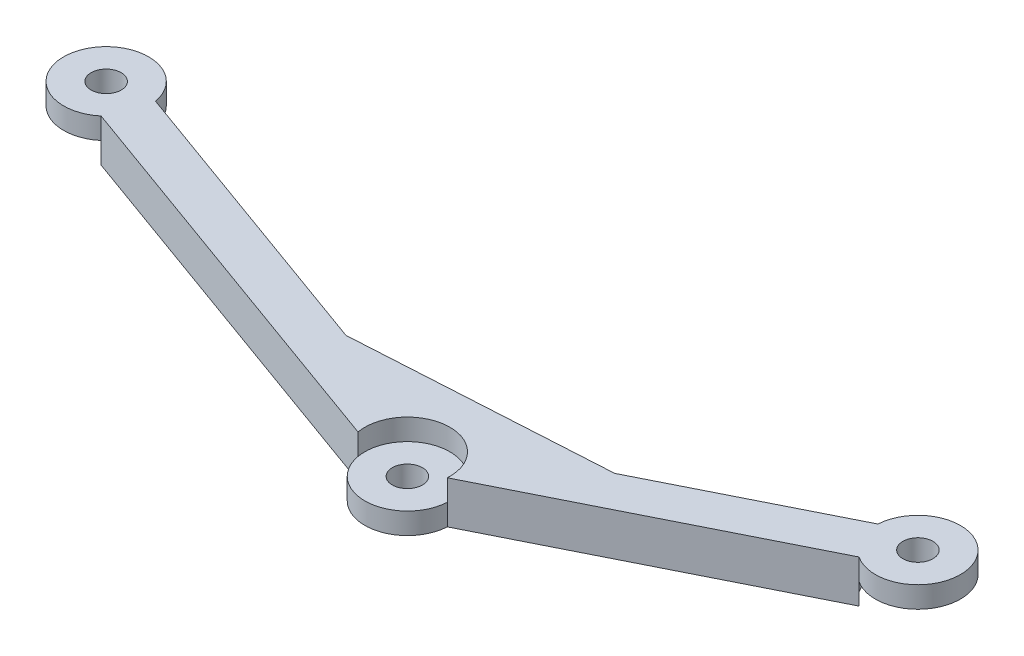
ISO-10303-21;
HEADER;
FILE_DESCRIPTION(('STEP AP214'),'2;1');
FILE_NAME('part.step','',(''),(''),'','','');
FILE_SCHEMA(('AUTOMOTIVE_DESIGN { 1 0 10303 214 1 1 1 1 }'));
ENDSEC;
DATA;
#1=APPLICATION_CONTEXT('core data for automotive mechanical design processes');
#2=APPLICATION_PROTOCOL_DEFINITION('international standard','automotive_design',2000,#1);
#3=PRODUCT_CONTEXT('',#1,'mechanical');
#4=PRODUCT('Part','Part','',(#3));
#5=PRODUCT_RELATED_PRODUCT_CATEGORY('part','',(#4));
#6=PRODUCT_DEFINITION_FORMATION('','',#4);
#7=PRODUCT_DEFINITION_CONTEXT('part definition',#1,'design');
#8=PRODUCT_DEFINITION('design','',#6,#7);
#9=PRODUCT_DEFINITION_SHAPE('','',#8);
#10=(LENGTH_UNIT() NAMED_UNIT(*) SI_UNIT(.MILLI.,.METRE.));
#11=(NAMED_UNIT(*) PLANE_ANGLE_UNIT() SI_UNIT($,.RADIAN.));
#12=(NAMED_UNIT(*) SI_UNIT($,.STERADIAN.) SOLID_ANGLE_UNIT());
#13=UNCERTAINTY_MEASURE_WITH_UNIT(LENGTH_MEASURE(1.E-05),#10,'distance_accuracy_value','');
#14=(GEOMETRIC_REPRESENTATION_CONTEXT(3) GLOBAL_UNCERTAINTY_ASSIGNED_CONTEXT((#13)) GLOBAL_UNIT_ASSIGNED_CONTEXT((#10,
#11,#12)) REPRESENTATION_CONTEXT('',''));
#15=CARTESIAN_POINT('',(0.,0.,0.));
#16=DIRECTION('',(0.,0.,1.));
#17=DIRECTION('',(1.,0.,0.));
#18=AXIS2_PLACEMENT_3D('',#15,#16,#17);
#19=CARTESIAN_POINT('',(22.8116968342877,6.35,45.6233936685753));
#20=DIRECTION('',(0.447213595499958,0.,0.894427190999916));
#21=DIRECTION('',(0.894427190999916,0.,-0.447213595499958));
#22=AXIS2_PLACEMENT_3D('',#19,#20,#21);
#23=PLANE('',#22);
#24=DIRECTION('',(0.,-1.,0.));
#25=VECTOR('',#24,1.);
#26=CARTESIAN_POINT('',(88.6237786073797,6.35,12.7173527820293));
#27=LINE('',#26,#25);
#28=CARTESIAN_POINT('',(88.6237786073797,6.35,12.7173527820293));
#29=VERTEX_POINT('',#28);
#30=CARTESIAN_POINT('',(88.6237786073797,0.,12.7173527820293));
#31=VERTEX_POINT('',#30);
#32=EDGE_CURVE('E129',#29,#31,#27,.T.);
#33=ORIENTED_EDGE('',*,*,#32,.F.);
#34=DIRECTION('',(-0.894427190999916,0.,0.447213595499958));
#35=VECTOR('',#34,1.);
#36=CARTESIAN_POINT('',(22.8116968342877,6.35,45.6233936685753));
#37=LINE('',#36,#35);
#38=CARTESIAN_POINT('',(114.819407984604,6.35,-0.380461906582968));
#39=VERTEX_POINT('',#38);
#40=EDGE_CURVE('E83',#39,#29,#37,.T.);
#41=ORIENTED_EDGE('',*,*,#40,.F.);
#42=DIRECTION('',(0.,-1.,0.));
#43=VECTOR('',#42,1.);
#44=CARTESIAN_POINT('',(114.819407984604,6.35,-0.380461906582968));
#45=LINE('',#44,#43);
#46=CARTESIAN_POINT('',(114.819407984604,3.175,-0.380461906582967));
#47=VERTEX_POINT('',#46);
#48=EDGE_CURVE('E42',#39,#47,#45,.T.);
#49=ORIENTED_EDGE('',*,*,#48,.T.);
#50=DIRECTION('',(0.,-1.,0.));
#51=VECTOR('',#50,1.);
#52=CARTESIAN_POINT('',(114.819407984604,3.175,-0.380461906582974));
#53=LINE('',#52,#51);
#54=CARTESIAN_POINT('',(114.819407984604,0.,-0.380461906582969));
#55=VERTEX_POINT('',#54);
#56=EDGE_CURVE('E215',#47,#55,#53,.T.);
#57=ORIENTED_EDGE('',*,*,#56,.T.);
#58=DIRECTION('',(-0.894427190999916,0.,0.447213595499958));
#59=VECTOR('',#58,1.);
#60=CARTESIAN_POINT('',(22.8116968342877,0.,45.6233936685753));
#61=LINE('',#60,#59);
#62=EDGE_CURVE('E140',#55,#31,#61,.T.);
#63=ORIENTED_EDGE('',*,*,#62,.T.);
#64=EDGE_LOOP('',(#33,#41,#49,#57,#63));
#65=FACE_BOUND('',#64,.T.);
#66=ADVANCED_FACE('F33',(#65),#23,.F.);
#67=CARTESIAN_POINT('',(1.07810624111919,6.35,-2.98635428790017));
#68=DIRECTION('',(-0.339561020824945,0.,0.940584027685098));
#69=DIRECTION('',(0.940584027685098,0.,0.339561020824945));
#70=AXIS2_PLACEMENT_3D('',#67,#68,#69);
#71=PLANE('',#70);
#72=DIRECTION('',(0.,-1.,0.));
#73=VECTOR('',#72,1.);
#74=CARTESIAN_POINT('',(50.7345465879939,6.35,14.9401584727044));
#75=LINE('',#74,#73);
#76=CARTESIAN_POINT('',(50.7345465879939,6.35,14.9401584727044));
#77=VERTEX_POINT('',#76);
#78=CARTESIAN_POINT('',(50.7345465879939,0.,14.9401584727044));
#79=VERTEX_POINT('',#78);
#80=EDGE_CURVE('E132',#77,#79,#75,.T.);
#81=ORIENTED_EDGE('',*,*,#80,.T.);
#82=DIRECTION('',(-0.940584027685098,0.,-0.339561020824945));
#83=VECTOR('',#82,1.);
#84=CARTESIAN_POINT('',(1.07810624111919,0.,-2.98635428790017));
#85=LINE('',#84,#83);
#86=CARTESIAN_POINT('',(6.2506235971635,0.,-1.11901950232461));
#87=VERTEX_POINT('',#86);
#88=EDGE_CURVE('E165',#79,#87,#85,.T.);
#89=ORIENTED_EDGE('',*,*,#88,.T.);
#90=DIRECTION('',(0.,-1.,0.));
#91=VECTOR('',#90,1.);
#92=CARTESIAN_POINT('',(6.2506235971635,3.175,-1.11901950232461));
#93=LINE('',#92,#91);
#94=CARTESIAN_POINT('',(6.2506235971635,3.175,-1.11901950232461));
#95=VERTEX_POINT('',#94);
#96=EDGE_CURVE('E195',#87,#95,#93,.F.);
#97=ORIENTED_EDGE('',*,*,#96,.T.);
#98=DIRECTION('',(0.,-1.,0.));
#99=VECTOR('',#98,1.);
#100=CARTESIAN_POINT('',(6.2506235971635,6.35,-1.11901950232461));
#101=LINE('',#100,#99);
#102=CARTESIAN_POINT('',(6.2506235971635,6.35,-1.11901950232461));
#103=VERTEX_POINT('',#102);
#104=EDGE_CURVE('E189',#103,#95,#101,.T.);
#105=ORIENTED_EDGE('',*,*,#104,.F.);
#106=DIRECTION('',(-0.940584027685098,0.,-0.339561020824945));
#107=VECTOR('',#106,1.);
#108=CARTESIAN_POINT('',(1.07810624111919,6.35,-2.98635428790017));
#109=LINE('',#108,#107);
#110=EDGE_CURVE('E147',#77,#103,#109,.T.);
#111=ORIENTED_EDGE('',*,*,#110,.F.);
#112=EDGE_LOOP('',(#81,#89,#97,#105,#111));
#113=FACE_BOUND('',#112,.T.);
#114=ADVANCED_FACE('F258',(#113),#71,.F.);
#115=CARTESIAN_POINT('',(70.358,6.35,25.4));
#116=DIRECTION('',(0.,-1.,0.));
#117=DIRECTION('',(0.,0.,-1.));
#118=AXIS2_PLACEMENT_3D('',#115,#116,#117);
#119=CYLINDRICAL_SURFACE('',#118,6.35);
#120=CARTESIAN_POINT('',(70.358,3.175,25.4));
#121=DIRECTION('',(0.,1.,0.));
#122=DIRECTION('',(0.,0.,1.));
#123=AXIS2_PLACEMENT_3D('',#120,#121,#122);
#124=CIRCLE('',#123,6.35000000000001);
#125=CARTESIAN_POINT('',(64.1073764028365,3.175,26.5190195023246));
#126=VERTEX_POINT('',#125);
#127=CARTESIAN_POINT('',(76.6965920153958,3.175,25.780461906583));
#128=VERTEX_POINT('',#127);
#129=EDGE_CURVE('E225',#126,#128,#124,.T.);
#130=ORIENTED_EDGE('',*,*,#129,.F.);
#131=DIRECTION('',(0.,-1.,0.));
#132=VECTOR('',#131,1.);
#133=CARTESIAN_POINT('',(64.1073764028365,6.35,26.5190195023246));
#134=LINE('',#133,#132);
#135=CARTESIAN_POINT('',(64.1073764028365,0.,26.5190195023246));
#136=VERTEX_POINT('',#135);
#137=EDGE_CURVE('E182',#126,#136,#134,.T.);
#138=ORIENTED_EDGE('',*,*,#137,.T.);
#139=CARTESIAN_POINT('',(70.358,0.,25.4));
#140=DIRECTION('',(0.,1.,0.));
#141=DIRECTION('',(0.,0.,1.));
#142=AXIS2_PLACEMENT_3D('',#139,#140,#141);
#143=CIRCLE('',#142,6.35);
#144=CARTESIAN_POINT('',(76.6965920153958,0.,25.780461906583));
#145=VERTEX_POINT('',#144);
#146=EDGE_CURVE('E171',#136,#145,#143,.T.);
#147=ORIENTED_EDGE('',*,*,#146,.T.);
#148=DIRECTION('',(0.,-1.,0.));
#149=VECTOR('',#148,1.);
#150=CARTESIAN_POINT('',(76.6965920153958,6.35,25.780461906583));
#151=LINE('',#150,#149);
#152=EDGE_CURVE('E68',#128,#145,#151,.T.);
#153=ORIENTED_EDGE('',*,*,#152,.F.);
#154=EDGE_LOOP('',(#130,#138,#147,#153));
#155=FACE_BOUND('',#154,.T.);
#156=ADVANCED_FACE('F263',(#155),#119,.T.);
#157=CARTESIAN_POINT('',(70.358,6.35,25.4));
#158=DIRECTION('',(0.,-1.,0.));
#159=DIRECTION('',(0.,0.,-1.));
#160=AXIS2_PLACEMENT_3D('',#157,#158,#159);
#161=CYLINDRICAL_SURFACE('',#160,2.24789999999999);
#162=CARTESIAN_POINT('',(70.358,0.,25.4));
#163=DIRECTION('',(0.,1.,0.));
#164=DIRECTION('',(0.,0.,1.));
#165=AXIS2_PLACEMENT_3D('',#162,#163,#164);
#166=CIRCLE('',#165,2.24789999999999);
#167=CARTESIAN_POINT('',(70.358,0.,27.6479));
#168=VERTEX_POINT('',#167);
#169=EDGE_CURVE('E176',#168,#168,#166,.T.);
#170=ORIENTED_EDGE('',*,*,#169,.F.);
#171=EDGE_LOOP('',(#170));
#172=FACE_BOUND('',#171,.T.);
#173=CARTESIAN_POINT('',(70.358,3.175,25.4));
#174=DIRECTION('',(0.,1.,0.));
#175=DIRECTION('',(0.,0.,1.));
#176=AXIS2_PLACEMENT_3D('',#173,#174,#175);
#177=CIRCLE('',#176,2.24789999999999);
#178=CARTESIAN_POINT('',(70.358,3.175,27.6479));
#179=VERTEX_POINT('',#178);
#180=EDGE_CURVE('E229',#179,#179,#177,.T.);
#181=ORIENTED_EDGE('',*,*,#180,.T.);
#182=EDGE_LOOP('',(#181));
#183=FACE_BOUND('',#182,.T.);
#184=ADVANCED_FACE('F269',(#172,#183),#161,.F.);
#185=CARTESIAN_POINT('',(121.158,6.35,0.));
#186=DIRECTION('',(0.,-1.,0.));
#187=DIRECTION('',(0.,0.,-1.));
#188=AXIS2_PLACEMENT_3D('',#185,#186,#187);
#189=CYLINDRICAL_SURFACE('',#188,6.35000000000008);
#190=CARTESIAN_POINT('',(121.158,3.175,0.));
#191=DIRECTION('',(0.,-1.,0.));
#192=DIRECTION('',(0.,0.,-1.));
#193=AXIS2_PLACEMENT_3D('',#190,#191,#192);
#194=CIRCLE('',#193,6.35000000000008);
#195=CARTESIAN_POINT('',(117.659214316029,3.175,5.29915075626648));
#196=VERTEX_POINT('',#195);
#197=EDGE_CURVE('E209',#47,#196,#194,.T.);
#198=ORIENTED_EDGE('',*,*,#197,.F.);
#199=ORIENTED_EDGE('',*,*,#48,.F.);
#200=CARTESIAN_POINT('',(121.158,6.35,0.));
#201=DIRECTION('',(0.,1.,0.));
#202=DIRECTION('',(0.,0.,1.));
#203=AXIS2_PLACEMENT_3D('',#200,#201,#202);
#204=CIRCLE('',#203,6.35000000000008);
#205=CARTESIAN_POINT('',(117.659214316029,6.35,5.29915075626648));
#206=VERTEX_POINT('',#205);
#207=EDGE_CURVE('E145',#206,#39,#204,.T.);
#208=ORIENTED_EDGE('',*,*,#207,.F.);
#209=DIRECTION('',(0.,-1.,0.));
#210=VECTOR('',#209,1.);
#211=CARTESIAN_POINT('',(117.659214316029,6.35,5.29915075626648));
#212=LINE('',#211,#210);
#213=EDGE_CURVE('E50',#206,#196,#212,.T.);
#214=ORIENTED_EDGE('',*,*,#213,.T.);
#215=EDGE_LOOP('',(#198,#199,#208,#214));
#216=FACE_BOUND('',#215,.T.);
#217=ADVANCED_FACE('F213',(#216),#189,.T.);
#218=CARTESIAN_POINT('',(0.,6.35,0.));
#219=DIRECTION('',(0.,-1.,0.));
#220=DIRECTION('',(0.,0.,-1.));
#221=AXIS2_PLACEMENT_3D('',#218,#219,#220);
#222=CYLINDRICAL_SURFACE('',#221,6.35);
#223=CARTESIAN_POINT('',(0.,3.175,0.));
#224=DIRECTION('',(0.,-1.,0.));
#225=DIRECTION('',(0.,0.,-1.));
#226=AXIS2_PLACEMENT_3D('',#223,#224,#225);
#227=CIRCLE('',#226,6.35);
#228=CARTESIAN_POINT('',(4.09441111492511,3.175,4.85368907347573));
#229=VERTEX_POINT('',#228);
#230=EDGE_CURVE('E235',#229,#95,#227,.T.);
#231=ORIENTED_EDGE('',*,*,#230,.F.);
#232=DIRECTION('',(0.,-1.,0.));
#233=VECTOR('',#232,1.);
#234=CARTESIAN_POINT('',(4.09441111492511,6.35,4.85368907347573));
#235=LINE('',#234,#233);
#236=CARTESIAN_POINT('',(4.09441111492511,6.35,4.85368907347573));
#237=VERTEX_POINT('',#236);
#238=EDGE_CURVE('E186',#237,#229,#235,.T.);
#239=ORIENTED_EDGE('',*,*,#238,.F.);
#240=CARTESIAN_POINT('',(0.,6.35,0.));
#241=DIRECTION('',(0.,1.,0.));
#242=DIRECTION('',(0.,0.,1.));
#243=AXIS2_PLACEMENT_3D('',#240,#241,#242);
#244=CIRCLE('',#243,6.35);
#245=EDGE_CURVE('E149',#103,#237,#244,.T.);
#246=ORIENTED_EDGE('',*,*,#245,.F.);
#247=ORIENTED_EDGE('',*,*,#104,.T.);
#248=EDGE_LOOP('',(#231,#239,#246,#247));
#249=FACE_BOUND('',#248,.T.);
#250=ADVANCED_FACE('F268',(#249),#222,.T.);
#251=CARTESIAN_POINT('',(121.158,6.35,0.));
#252=DIRECTION('',(0.,-1.,0.));
#253=DIRECTION('',(0.,0.,-1.));
#254=AXIS2_PLACEMENT_3D('',#251,#252,#253);
#255=CYLINDRICAL_SURFACE('',#254,2.2479);
#256=CARTESIAN_POINT('',(121.158,6.35,0.));
#257=DIRECTION('',(0.,1.,0.));
#258=DIRECTION('',(0.,0.,1.));
#259=AXIS2_PLACEMENT_3D('',#256,#257,#258);
#260=CIRCLE('',#259,2.2479);
#261=CARTESIAN_POINT('',(121.158,6.35,2.2479));
#262=VERTEX_POINT('',#261);
#263=EDGE_CURVE('E151',#262,#262,#260,.T.);
#264=ORIENTED_EDGE('',*,*,#263,.T.);
#265=EDGE_LOOP('',(#264));
#266=FACE_BOUND('',#265,.T.);
#267=CARTESIAN_POINT('',(121.158,3.175,0.));
#268=DIRECTION('',(0.,-1.,0.));
#269=DIRECTION('',(0.,0.,-1.));
#270=AXIS2_PLACEMENT_3D('',#267,#268,#269);
#271=CIRCLE('',#270,2.2479);
#272=CARTESIAN_POINT('',(121.158,3.175,-2.2479));
#273=VERTEX_POINT('',#272);
#274=EDGE_CURVE('E166',#273,#273,#271,.T.);
#275=ORIENTED_EDGE('',*,*,#274,.T.);
#276=EDGE_LOOP('',(#275));
#277=FACE_BOUND('',#276,.T.);
#278=ADVANCED_FACE('F35',(#266,#277),#255,.F.);
#279=CARTESIAN_POINT('',(0.,6.35,0.));
#280=DIRECTION('',(0.,-1.,0.));
#281=DIRECTION('',(0.,0.,-1.));
#282=AXIS2_PLACEMENT_3D('',#279,#280,#281);
#283=CYLINDRICAL_SURFACE('',#282,2.2479);
#284=CARTESIAN_POINT('',(0.,6.35,0.));
#285=DIRECTION('',(0.,1.,0.));
#286=DIRECTION('',(0.,0.,1.));
#287=AXIS2_PLACEMENT_3D('',#284,#285,#286);
#288=CIRCLE('',#287,2.2479);
#289=CARTESIAN_POINT('',(0.,6.35,2.2479));
#290=VERTEX_POINT('',#289);
#291=EDGE_CURVE('E161',#290,#290,#288,.T.);
#292=ORIENTED_EDGE('',*,*,#291,.T.);
#293=EDGE_LOOP('',(#292));
#294=FACE_BOUND('',#293,.T.);
#295=CARTESIAN_POINT('',(0.,3.175,0.));
#296=DIRECTION('',(0.,-1.,0.));
#297=DIRECTION('',(0.,0.,-1.));
#298=AXIS2_PLACEMENT_3D('',#295,#296,#297);
#299=CIRCLE('',#298,2.2479);
#300=CARTESIAN_POINT('',(0.,3.175,-2.2479));
#301=VERTEX_POINT('',#300);
#302=EDGE_CURVE('E193',#301,#301,#299,.T.);
#303=ORIENTED_EDGE('',*,*,#302,.T.);
#304=EDGE_LOOP('',(#303));
#305=FACE_BOUND('',#304,.T.);
#306=ADVANCED_FACE('F286',(#294,#305),#283,.F.);
#307=CARTESIAN_POINT('',(-1.0781062411192,6.35,2.98635428790017));
#308=DIRECTION('',(-0.339561020824945,0.,0.940584027685098));
#309=DIRECTION('',(0.940584027685098,0.,0.339561020824945));
#310=AXIS2_PLACEMENT_3D('',#307,#308,#309);
#311=PLANE('',#310);
#312=DIRECTION('',(-0.940584027685098,0.,-0.339561020824945));
#313=VECTOR('',#312,1.);
#314=CARTESIAN_POINT('',(-1.0781062411192,0.,2.98635428790017));
#315=LINE('',#314,#313);
#316=CARTESIAN_POINT('',(4.09441111492511,0.,4.85368907347573));
#317=VERTEX_POINT('',#316);
#318=EDGE_CURVE('E168',#136,#317,#315,.T.);
#319=ORIENTED_EDGE('',*,*,#318,.F.);
#320=ORIENTED_EDGE('',*,*,#137,.F.);
#321=CARTESIAN_POINT('',(64.1073764028365,6.35,26.5190195023246));
#322=VERTEX_POINT('',#321);
#323=EDGE_CURVE('E183',#322,#126,#134,.T.);
#324=ORIENTED_EDGE('',*,*,#323,.F.);
#325=DIRECTION('',(-0.940584027685098,0.,-0.339561020824945));
#326=VECTOR('',#325,1.);
#327=CARTESIAN_POINT('',(-1.0781062411192,6.35,2.98635428790017));
#328=LINE('',#327,#326);
#329=EDGE_CURVE('E156',#322,#237,#328,.T.);
#330=ORIENTED_EDGE('',*,*,#329,.T.);
#331=ORIENTED_EDGE('',*,*,#238,.T.);
#332=DIRECTION('',(0.,-1.,0.));
#333=VECTOR('',#332,1.);
#334=CARTESIAN_POINT('',(4.09441111492511,3.175,4.85368907347573));
#335=LINE('',#334,#333);
#336=EDGE_CURVE('E216',#317,#229,#335,.F.);
#337=ORIENTED_EDGE('',*,*,#336,.F.);
#338=EDGE_LOOP('',(#319,#320,#324,#330,#331,#337));
#339=FACE_BOUND('',#338,.T.);
#340=ADVANCED_FACE('F254',(#339),#311,.T.);
#341=CARTESIAN_POINT('',(25.6515031657123,6.35,51.3030063314247));
#342=DIRECTION('',(0.447213595499958,0.,0.894427190999916));
#343=DIRECTION('',(0.894427190999916,0.,-0.447213595499958));
#344=AXIS2_PLACEMENT_3D('',#341,#342,#343);
#345=PLANE('',#344);
#346=DIRECTION('',(-0.894427190999916,0.,0.447213595499958));
#347=VECTOR('',#346,1.);
#348=CARTESIAN_POINT('',(25.6515031657123,0.,51.3030063314247));
#349=LINE('',#348,#347);
#350=CARTESIAN_POINT('',(117.659214316029,0.,5.29915075626648));
#351=VERTEX_POINT('',#350);
#352=EDGE_CURVE('E173',#351,#145,#349,.T.);
#353=ORIENTED_EDGE('',*,*,#352,.F.);
#354=DIRECTION('',(0.,-1.,0.));
#355=VECTOR('',#354,1.);
#356=CARTESIAN_POINT('',(117.659214316029,3.175,5.29915075626648));
#357=LINE('',#356,#355);
#358=EDGE_CURVE('E75',#196,#351,#357,.T.);
#359=ORIENTED_EDGE('',*,*,#358,.F.);
#360=ORIENTED_EDGE('',*,*,#213,.F.);
#361=DIRECTION('',(-0.894427190999916,0.,0.447213595499958));
#362=VECTOR('',#361,1.);
#363=CARTESIAN_POINT('',(25.6515031657123,6.35,51.3030063314247));
#364=LINE('',#363,#362);
#365=CARTESIAN_POINT('',(76.6965920153958,6.35,25.780461906583));
#366=VERTEX_POINT('',#365);
#367=EDGE_CURVE('E159',#206,#366,#364,.T.);
#368=ORIENTED_EDGE('',*,*,#367,.T.);
#369=EDGE_CURVE('E180',#366,#128,#151,.T.);
#370=ORIENTED_EDGE('',*,*,#369,.T.);
#371=ORIENTED_EDGE('',*,*,#152,.T.);
#372=EDGE_LOOP('',(#353,#359,#360,#368,#370,#371));
#373=FACE_BOUND('',#372,.T.);
#374=ADVANCED_FACE('F246',(#373),#345,.T.);
#375=CARTESIAN_POINT('',(0.,6.35,0.));
#376=DIRECTION('',(0.,1.,0.));
#377=DIRECTION('',(0.,0.,1.));
#378=AXIS2_PLACEMENT_3D('',#375,#376,#377);
#379=PLANE('',#378);
#380=CARTESIAN_POINT('',(70.358,6.35,25.4));
#381=DIRECTION('',(0.,1.,0.));
#382=DIRECTION('',(0.,0.,1.));
#383=AXIS2_PLACEMENT_3D('',#380,#381,#382);
#384=CIRCLE('',#383,6.35000000000001);
#385=EDGE_CURVE('E11',#366,#322,#384,.T.);
#386=ORIENTED_EDGE('',*,*,#385,.F.);
#387=ORIENTED_EDGE('',*,*,#367,.F.);
#388=ORIENTED_EDGE('',*,*,#207,.T.);
#389=ORIENTED_EDGE('',*,*,#40,.T.);
#390=DIRECTION('',(-0.998283585660039,0.,0.0585651995790626));
#391=VECTOR('',#390,1.);
#392=CARTESIAN_POINT('',(1.04748508451904,6.35,17.8550943839507));
#393=LINE('',#392,#391);
#394=EDGE_CURVE('E127',#29,#77,#393,.T.);
#395=ORIENTED_EDGE('',*,*,#394,.T.);
#396=ORIENTED_EDGE('',*,*,#110,.T.);
#397=ORIENTED_EDGE('',*,*,#245,.T.);
#398=ORIENTED_EDGE('',*,*,#329,.F.);
#399=EDGE_LOOP('',(#386,#387,#388,#389,#395,#396,#397,#398));
#400=FACE_BOUND('',#399,.T.);
#401=ORIENTED_EDGE('',*,*,#291,.F.);
#402=EDGE_LOOP('',(#401));
#403=FACE_BOUND('',#402,.T.);
#404=ORIENTED_EDGE('',*,*,#263,.F.);
#405=EDGE_LOOP('',(#404));
#406=FACE_BOUND('',#405,.T.);
#407=ADVANCED_FACE('F142',(#400,#403,#406),#379,.T.);
#408=CARTESIAN_POINT('',(0.,0.,0.));
#409=DIRECTION('',(0.,1.,0.));
#410=DIRECTION('',(0.,0.,1.));
#411=AXIS2_PLACEMENT_3D('',#408,#409,#410);
#412=PLANE('',#411);
#413=ORIENTED_EDGE('',*,*,#88,.F.);
#414=DIRECTION('',(-0.998283585660039,0.,0.0585651995790626));
#415=VECTOR('',#414,1.);
#416=CARTESIAN_POINT('',(1.04748508451904,0.,17.8550943839507));
#417=LINE('',#416,#415);
#418=EDGE_CURVE('E135',#31,#79,#417,.T.);
#419=ORIENTED_EDGE('',*,*,#418,.F.);
#420=ORIENTED_EDGE('',*,*,#62,.F.);
#421=CARTESIAN_POINT('',(121.158,0.,0.));
#422=DIRECTION('',(0.,-1.,0.));
#423=DIRECTION('',(0.,0.,-1.));
#424=AXIS2_PLACEMENT_3D('',#421,#422,#423);
#425=CIRCLE('',#424,6.35000000000008);
#426=EDGE_CURVE('E214',#351,#55,#425,.T.);
#427=ORIENTED_EDGE('',*,*,#426,.F.);
#428=ORIENTED_EDGE('',*,*,#352,.T.);
#429=ORIENTED_EDGE('',*,*,#146,.F.);
#430=ORIENTED_EDGE('',*,*,#318,.T.);
#431=CARTESIAN_POINT('',(0.,0.,0.));
#432=DIRECTION('',(0.,-1.,0.));
#433=DIRECTION('',(0.,0.,-1.));
#434=AXIS2_PLACEMENT_3D('',#431,#432,#433);
#435=CIRCLE('',#434,6.35);
#436=EDGE_CURVE('E210',#87,#317,#435,.T.);
#437=ORIENTED_EDGE('',*,*,#436,.F.);
#438=EDGE_LOOP('',(#413,#419,#420,#427,#428,#429,#430,#437));
#439=FACE_BOUND('',#438,.T.);
#440=ORIENTED_EDGE('',*,*,#169,.T.);
#441=EDGE_LOOP('',(#440));
#442=FACE_BOUND('',#441,.T.);
#443=ADVANCED_FACE('F220',(#439,#442),#412,.F.);
#444=CARTESIAN_POINT('',(121.158,3.175,0.));
#445=DIRECTION('',(0.,-1.,0.));
#446=DIRECTION('',(0.,0.,-1.));
#447=AXIS2_PLACEMENT_3D('',#444,#445,#446);
#448=CYLINDRICAL_SURFACE('',#447,6.35000000000008);
#449=EDGE_CURVE('E207',#196,#47,#194,.T.);
#450=ORIENTED_EDGE('',*,*,#449,.F.);
#451=ORIENTED_EDGE('',*,*,#358,.T.);
#452=ORIENTED_EDGE('',*,*,#426,.T.);
#453=ORIENTED_EDGE('',*,*,#56,.F.);
#454=EDGE_LOOP('',(#450,#451,#452,#453));
#455=FACE_BOUND('',#454,.T.);
#456=ADVANCED_FACE('F204',(#455),#448,.F.);
#457=CARTESIAN_POINT('',(121.158,3.175,0.));
#458=DIRECTION('',(0.,-1.,0.));
#459=DIRECTION('',(0.,0.,-1.));
#460=AXIS2_PLACEMENT_3D('',#457,#458,#459);
#461=PLANE('',#460);
#462=ORIENTED_EDGE('',*,*,#274,.F.);
#463=EDGE_LOOP('',(#462));
#464=FACE_BOUND('',#463,.T.);
#465=ORIENTED_EDGE('',*,*,#449,.T.);
#466=ORIENTED_EDGE('',*,*,#197,.T.);
#467=EDGE_LOOP('',(#465,#466));
#468=FACE_BOUND('',#467,.T.);
#469=ADVANCED_FACE('F200',(#464,#468),#461,.T.);
#470=CARTESIAN_POINT('',(0.,3.175,0.));
#471=DIRECTION('',(0.,-1.,0.));
#472=DIRECTION('',(0.,0.,-1.));
#473=AXIS2_PLACEMENT_3D('',#470,#471,#472);
#474=CYLINDRICAL_SURFACE('',#473,6.35);
#475=ORIENTED_EDGE('',*,*,#436,.T.);
#476=ORIENTED_EDGE('',*,*,#336,.T.);
#477=EDGE_CURVE('E232',#95,#229,#227,.T.);
#478=ORIENTED_EDGE('',*,*,#477,.F.);
#479=ORIENTED_EDGE('',*,*,#96,.F.);
#480=EDGE_LOOP('',(#475,#476,#478,#479));
#481=FACE_BOUND('',#480,.T.);
#482=ADVANCED_FACE('F203',(#481),#474,.F.);
#483=CARTESIAN_POINT('',(0.,3.175,0.));
#484=DIRECTION('',(0.,-1.,0.));
#485=DIRECTION('',(0.,0.,-1.));
#486=AXIS2_PLACEMENT_3D('',#483,#484,#485);
#487=PLANE('',#486);
#488=ORIENTED_EDGE('',*,*,#302,.F.);
#489=EDGE_LOOP('',(#488));
#490=FACE_BOUND('',#489,.T.);
#491=ORIENTED_EDGE('',*,*,#477,.T.);
#492=ORIENTED_EDGE('',*,*,#230,.T.);
#493=EDGE_LOOP('',(#491,#492));
#494=FACE_BOUND('',#493,.T.);
#495=ADVANCED_FACE('F312',(#490,#494),#487,.T.);
#496=CARTESIAN_POINT('',(70.358,3.175,25.4));
#497=DIRECTION('',(0.,1.,0.));
#498=DIRECTION('',(0.,0.,1.));
#499=AXIS2_PLACEMENT_3D('',#496,#497,#498);
#500=CYLINDRICAL_SURFACE('',#499,6.35000000000001);
#501=EDGE_CURVE('E227',#128,#126,#124,.T.);
#502=ORIENTED_EDGE('',*,*,#501,.F.);
#503=ORIENTED_EDGE('',*,*,#369,.F.);
#504=ORIENTED_EDGE('',*,*,#385,.T.);
#505=ORIENTED_EDGE('',*,*,#323,.T.);
#506=EDGE_LOOP('',(#502,#503,#504,#505));
#507=FACE_BOUND('',#506,.T.);
#508=ADVANCED_FACE('F304',(#507),#500,.F.);
#509=CARTESIAN_POINT('',(70.358,3.175,25.4));
#510=DIRECTION('',(0.,1.,0.));
#511=DIRECTION('',(0.,0.,1.));
#512=AXIS2_PLACEMENT_3D('',#509,#510,#511);
#513=PLANE('',#512);
#514=ORIENTED_EDGE('',*,*,#180,.F.);
#515=EDGE_LOOP('',(#514));
#516=FACE_BOUND('',#515,.T.);
#517=ORIENTED_EDGE('',*,*,#501,.T.);
#518=ORIENTED_EDGE('',*,*,#129,.T.);
#519=EDGE_LOOP('',(#517,#518));
#520=FACE_BOUND('',#519,.T.);
#521=ADVANCED_FACE('F301',(#516,#520),#513,.T.);
#522=CARTESIAN_POINT('',(1.04748508451904,6.35,17.8550943839507));
#523=DIRECTION('',(0.0585651995790626,0.,0.998283585660039));
#524=DIRECTION('',(0.998283585660039,0.,-0.0585651995790626));
#525=AXIS2_PLACEMENT_3D('',#522,#523,#524);
#526=PLANE('',#525);
#527=ORIENTED_EDGE('',*,*,#418,.T.);
#528=ORIENTED_EDGE('',*,*,#80,.F.);
#529=ORIENTED_EDGE('',*,*,#394,.F.);
#530=ORIENTED_EDGE('',*,*,#32,.T.);
#531=EDGE_LOOP('',(#527,#528,#529,#530));
#532=FACE_BOUND('',#531,.T.);
#533=ADVANCED_FACE('F128',(#532),#526,.F.);
#534=CLOSED_SHELL('',(#66,#114,#156,#184,#217,#250,#278,#306,#340,#374,#407,#443,#456,#469,#482,
#495,#508,#521,#533));
#535=MANIFOLD_SOLID_BREP('B2',#534);
#536=ADVANCED_BREP_SHAPE_REPRESENTATION('',(#18,#535),#14);
#537=SHAPE_DEFINITION_REPRESENTATION(#9,#536);
ENDSEC;
END-ISO-10303-21;
